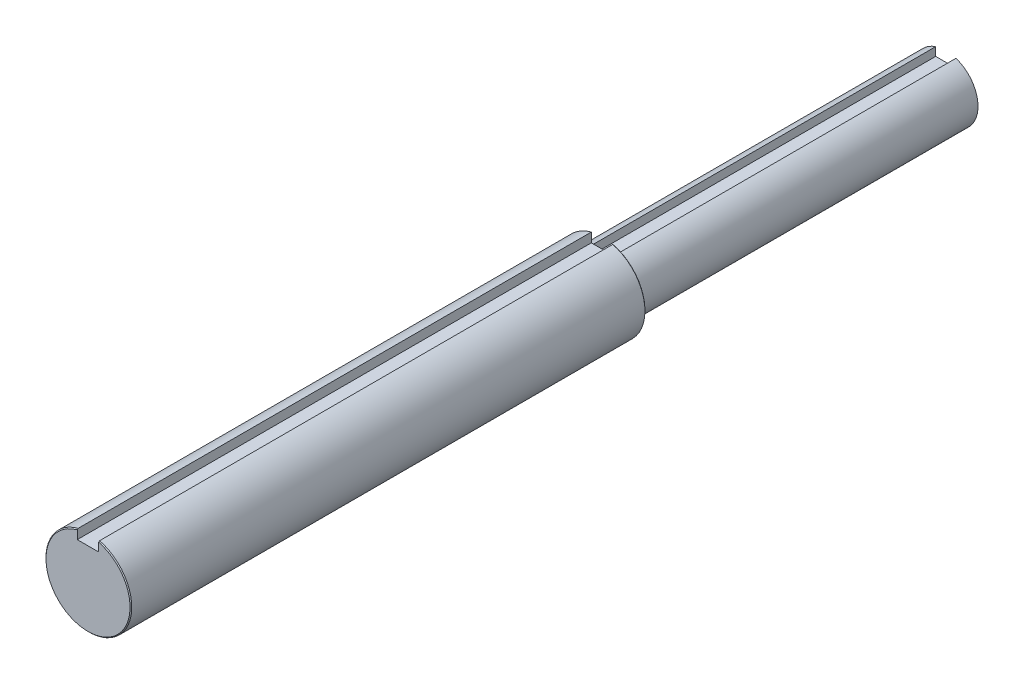
ISO-10303-21;
HEADER;
FILE_DESCRIPTION(('STEP AP214'),'2;1');
FILE_NAME('part.step','',(''),(''),'','','');
FILE_SCHEMA(('AUTOMOTIVE_DESIGN { 1 0 10303 214 1 1 1 1 }'));
ENDSEC;
DATA;
#1=APPLICATION_CONTEXT('core data for automotive mechanical design processes');
#2=APPLICATION_PROTOCOL_DEFINITION('international standard','automotive_design',2000,#1);
#3=PRODUCT_CONTEXT('',#1,'mechanical');
#4=PRODUCT('Part','Part','',(#3));
#5=PRODUCT_RELATED_PRODUCT_CATEGORY('part','',(#4));
#6=PRODUCT_DEFINITION_FORMATION('','',#4);
#7=PRODUCT_DEFINITION_CONTEXT('part definition',#1,'design');
#8=PRODUCT_DEFINITION('design','',#6,#7);
#9=PRODUCT_DEFINITION_SHAPE('','',#8);
#10=(LENGTH_UNIT() NAMED_UNIT(*) SI_UNIT(.MILLI.,.METRE.));
#11=(NAMED_UNIT(*) PLANE_ANGLE_UNIT() SI_UNIT($,.RADIAN.));
#12=(NAMED_UNIT(*) SI_UNIT($,.STERADIAN.) SOLID_ANGLE_UNIT());
#13=UNCERTAINTY_MEASURE_WITH_UNIT(LENGTH_MEASURE(1.E-05),#10,'distance_accuracy_value','');
#14=(GEOMETRIC_REPRESENTATION_CONTEXT(3) GLOBAL_UNCERTAINTY_ASSIGNED_CONTEXT((#13)) GLOBAL_UNIT_ASSIGNED_CONTEXT((#10,
#11,#12)) REPRESENTATION_CONTEXT('',''));
#15=CARTESIAN_POINT('',(0.,0.,0.));
#16=DIRECTION('',(0.,0.,1.));
#17=DIRECTION('',(1.,0.,0.));
#18=AXIS2_PLACEMENT_3D('',#15,#16,#17);
#19=CARTESIAN_POINT('',(0.,0.,304.8));
#20=DIRECTION('',(0.,0.,-1.));
#21=DIRECTION('',(-1.,0.,0.));
#22=AXIS2_PLACEMENT_3D('',#19,#20,#21);
#23=CYLINDRICAL_SURFACE('',#22,12.7);
#24=DIRECTION('',(0.,0.,-1.));
#25=VECTOR('',#24,1.);
#26=CARTESIAN_POINT('',(-3.175,12.2967221242085,304.8));
#27=LINE('',#26,#25);
#28=CARTESIAN_POINT('',(-3.175,12.2967221242085,304.546));
#29=VERTEX_POINT('',#28);
#30=CARTESIAN_POINT('',(-3.175,12.2967221242085,152.6));
#31=VERTEX_POINT('',#30);
#32=EDGE_CURVE('E187',#29,#31,#27,.T.);
#33=ORIENTED_EDGE('',*,*,#32,.T.);
#34=CARTESIAN_POINT('',(0.,0.,152.6));
#35=DIRECTION('',(0.,0.,1.));
#36=DIRECTION('',(1.,0.,0.));
#37=AXIS2_PLACEMENT_3D('',#34,#35,#36);
#38=CIRCLE('',#37,12.7);
#39=CARTESIAN_POINT('',(3.175,12.2967221242085,152.6));
#40=VERTEX_POINT('',#39);
#41=EDGE_CURVE('E59',#31,#40,#38,.T.);
#42=ORIENTED_EDGE('',*,*,#41,.T.);
#43=DIRECTION('',(0.,0.,-1.));
#44=VECTOR('',#43,1.);
#45=CARTESIAN_POINT('',(3.175,12.2967221242085,304.8));
#46=LINE('',#45,#44);
#47=CARTESIAN_POINT('',(3.175,12.2967221242085,304.546));
#48=VERTEX_POINT('',#47);
#49=EDGE_CURVE('E197',#48,#40,#46,.T.);
#50=ORIENTED_EDGE('',*,*,#49,.F.);
#51=CARTESIAN_POINT('',(0.,0.,304.546));
#52=DIRECTION('',(0.,0.,1.));
#53=DIRECTION('',(1.,0.,0.));
#54=AXIS2_PLACEMENT_3D('',#51,#52,#53);
#55=CIRCLE('',#54,12.7);
#56=EDGE_CURVE('E201',#48,#29,#55,.F.);
#57=ORIENTED_EDGE('',*,*,#56,.T.);
#58=EDGE_LOOP('',(#33,#42,#50,#57));
#59=FACE_BOUND('',#58,.T.);
#60=ADVANCED_FACE('F49',(#59),#23,.T.);
#61=CARTESIAN_POINT('',(3.175,9.52499999999995,304.8));
#62=DIRECTION('',(1.,0.,0.));
#63=DIRECTION('',(0.,0.,-1.));
#64=AXIS2_PLACEMENT_3D('',#61,#62,#63);
#65=PLANE('',#64);
#66=ORIENTED_EDGE('',*,*,#49,.T.);
#67=DIRECTION('',(0.,-1.,0.));
#68=VECTOR('',#67,1.);
#69=CARTESIAN_POINT('',(3.175,9.52499999999995,152.6));
#70=LINE('',#69,#68);
#71=CARTESIAN_POINT('',(3.175,9.52499999999995,152.6));
#72=VERTEX_POINT('',#71);
#73=EDGE_CURVE('E294',#40,#72,#70,.T.);
#74=ORIENTED_EDGE('',*,*,#73,.T.);
#75=DIRECTION('',(0.,0.,-1.));
#76=VECTOR('',#75,1.);
#77=CARTESIAN_POINT('',(3.175,9.52499999999995,304.8));
#78=LINE('',#77,#76);
#79=CARTESIAN_POINT('',(3.175,9.52499999999995,304.8));
#80=VERTEX_POINT('',#79);
#81=EDGE_CURVE('E193',#80,#72,#78,.T.);
#82=ORIENTED_EDGE('',*,*,#81,.F.);
#83=DIRECTION('',(0.,-1.,0.));
#84=VECTOR('',#83,1.);
#85=CARTESIAN_POINT('',(3.175,9.52499999999995,304.8));
#86=LINE('',#85,#84);
#87=CARTESIAN_POINT('',(3.175,12.0342133519396,304.8));
#88=VERTEX_POINT('',#87);
#89=EDGE_CURVE('E177',#88,#80,#86,.T.);
#90=ORIENTED_EDGE('',*,*,#89,.F.);
#91=CARTESIAN_POINT('',(3.175,12.0342133519396,304.8));
#92=CARTESIAN_POINT('',(3.175,12.0779793705573,304.757681710846));
#93=CARTESIAN_POINT('',(3.175,12.1217381108952,304.715355899595));
#94=CARTESIAN_POINT('',(3.175,12.2092410349848,304.630689232929));
#95=CARTESIAN_POINT('',(3.175,12.2529852187366,304.588348377512));
#96=CARTESIAN_POINT('',(3.175,12.2967221242085,304.546));
#97=B_SPLINE_CURVE_WITH_KNOTS('',3,(#91,#92,#93,#94,#95,#96),.UNSPECIFIED.,.F.,.F.,(4,2,4),(0.,
0.182638207627681,0.365276415146294),.UNSPECIFIED.);
#98=EDGE_CURVE('E204',#88,#48,#97,.T.);
#99=ORIENTED_EDGE('',*,*,#98,.T.);
#100=EDGE_LOOP('',(#66,#74,#82,#90,#99));
#101=FACE_BOUND('',#100,.T.);
#102=ADVANCED_FACE('F224',(#101),#65,.F.);
#103=CARTESIAN_POINT('',(3.175,9.52499999999995,304.8));
#104=DIRECTION('',(0.,-1.,0.));
#105=DIRECTION('',(0.,0.,-1.));
#106=AXIS2_PLACEMENT_3D('',#103,#104,#105);
#107=PLANE('',#106);
#108=ORIENTED_EDGE('',*,*,#81,.T.);
#109=DIRECTION('',(-1.,0.,0.));
#110=VECTOR('',#109,1.);
#111=CARTESIAN_POINT('',(3.175,9.52499999999995,152.6));
#112=LINE('',#111,#110);
#113=CARTESIAN_POINT('',(-3.175,9.52499999999995,152.6));
#114=VERTEX_POINT('',#113);
#115=EDGE_CURVE('E297',#72,#114,#112,.T.);
#116=ORIENTED_EDGE('',*,*,#115,.T.);
#117=DIRECTION('',(0.,0.,-1.));
#118=VECTOR('',#117,1.);
#119=CARTESIAN_POINT('',(-3.175,9.52499999999995,304.8));
#120=LINE('',#119,#118);
#121=CARTESIAN_POINT('',(-3.175,9.52499999999995,304.8));
#122=VERTEX_POINT('',#121);
#123=EDGE_CURVE('E190',#122,#114,#120,.T.);
#124=ORIENTED_EDGE('',*,*,#123,.F.);
#125=DIRECTION('',(-1.,0.,0.));
#126=VECTOR('',#125,1.);
#127=CARTESIAN_POINT('',(3.175,9.52499999999995,304.8));
#128=LINE('',#127,#126);
#129=EDGE_CURVE('E180',#80,#122,#128,.T.);
#130=ORIENTED_EDGE('',*,*,#129,.F.);
#131=EDGE_LOOP('',(#108,#116,#124,#130));
#132=FACE_BOUND('',#131,.T.);
#133=ADVANCED_FACE('F228',(#132),#107,.F.);
#134=CARTESIAN_POINT('',(-3.175,9.52499999999995,304.8));
#135=DIRECTION('',(-1.,0.,0.));
#136=DIRECTION('',(0.,0.,1.));
#137=AXIS2_PLACEMENT_3D('',#134,#135,#136);
#138=PLANE('',#137);
#139=ORIENTED_EDGE('',*,*,#123,.T.);
#140=DIRECTION('',(0.,1.,0.));
#141=VECTOR('',#140,1.);
#142=CARTESIAN_POINT('',(-3.175,9.52499999999995,152.6));
#143=LINE('',#142,#141);
#144=EDGE_CURVE('E73',#114,#31,#143,.T.);
#145=ORIENTED_EDGE('',*,*,#144,.T.);
#146=ORIENTED_EDGE('',*,*,#32,.F.);
#147=CARTESIAN_POINT('',(-3.175,12.2967221242085,304.546));
#148=CARTESIAN_POINT('',(-3.175,12.2529852187366,304.588348377512));
#149=CARTESIAN_POINT('',(-3.175,12.2092410349848,304.630689232929));
#150=CARTESIAN_POINT('',(-3.175,12.1217381108952,304.715355899595));
#151=CARTESIAN_POINT('',(-3.175,12.0779793705573,304.757681710846));
#152=CARTESIAN_POINT('',(-3.175,12.0342133519395,304.8));
#153=B_SPLINE_CURVE_WITH_KNOTS('',3,(#147,#148,#149,#150,#151,#152),.UNSPECIFIED.,.F.,.F.,(4,2,
4),(0.,0.182638207518613,0.365276415146298),.UNSPECIFIED.);
#154=CARTESIAN_POINT('',(-3.175,12.0342133519396,304.8));
#155=VERTEX_POINT('',#154);
#156=EDGE_CURVE('E213',#29,#155,#153,.T.);
#157=ORIENTED_EDGE('',*,*,#156,.T.);
#158=DIRECTION('',(0.,1.,0.));
#159=VECTOR('',#158,1.);
#160=CARTESIAN_POINT('',(-3.175,9.52499999999995,304.8));
#161=LINE('',#160,#159);
#162=EDGE_CURVE('E183',#122,#155,#161,.T.);
#163=ORIENTED_EDGE('',*,*,#162,.F.);
#164=EDGE_LOOP('',(#139,#145,#146,#157,#163));
#165=FACE_BOUND('',#164,.T.);
#166=ADVANCED_FACE('F394',(#165),#138,.F.);
#167=CARTESIAN_POINT('',(0.,0.,304.8));
#168=DIRECTION('',(0.,0.,1.));
#169=DIRECTION('',(1.,0.,0.));
#170=AXIS2_PLACEMENT_3D('',#167,#168,#169);
#171=PLANE('',#170);
#172=ORIENTED_EDGE('',*,*,#162,.T.);
#173=CARTESIAN_POINT('',(0.,0.,304.8));
#174=DIRECTION('',(0.,0.,1.));
#175=DIRECTION('',(1.,0.,0.));
#176=AXIS2_PLACEMENT_3D('',#173,#174,#175);
#177=CIRCLE('',#176,12.446);
#178=EDGE_CURVE('E361',#155,#88,#177,.T.);
#179=ORIENTED_EDGE('',*,*,#178,.T.);
#180=ORIENTED_EDGE('',*,*,#89,.T.);
#181=ORIENTED_EDGE('',*,*,#129,.T.);
#182=EDGE_LOOP('',(#172,#179,#180,#181));
#183=FACE_BOUND('',#182,.T.);
#184=ADVANCED_FACE('F397',(#183),#171,.T.);
#185=CARTESIAN_POINT('',(0.,0.,304.8));
#186=DIRECTION('',(0.,0.,-1.));
#187=DIRECTION('',(-1.,0.,0.));
#188=AXIS2_PLACEMENT_3D('',#185,#186,#187);
#189=CONICAL_SURFACE('',#188,12.446,0.785398163397377);
#190=ORIENTED_EDGE('',*,*,#156,.F.);
#191=ORIENTED_EDGE('',*,*,#56,.F.);
#192=ORIENTED_EDGE('',*,*,#98,.F.);
#193=ORIENTED_EDGE('',*,*,#178,.F.);
#194=EDGE_LOOP('',(#190,#191,#192,#193));
#195=FACE_BOUND('',#194,.T.);
#196=ADVANCED_FACE('F220',(#195),#189,.T.);
#197=CARTESIAN_POINT('',(0.,0.,152.4));
#198=DIRECTION('',(0.,0.,1.));
#199=DIRECTION('',(1.,0.,0.));
#200=AXIS2_PLACEMENT_3D('',#197,#198,#199);
#201=PLANE('',#200);
#202=DIRECTION('',(-1.,0.,0.));
#203=VECTOR('',#202,1.);
#204=CARTESIAN_POINT('',(-3.,6.72499999999999,152.4));
#205=LINE('',#204,#203);
#206=CARTESIAN_POINT('',(2.79999999999996,6.72499999999999,152.4));
#207=VERTEX_POINT('',#206);
#208=CARTESIAN_POINT('',(-2.79999999999996,6.72499999999999,152.4));
#209=VERTEX_POINT('',#208);
#210=EDGE_CURVE('E374',#207,#209,#205,.T.);
#211=ORIENTED_EDGE('',*,*,#210,.T.);
#212=DIRECTION('',(0.,1.,0.));
#213=VECTOR('',#212,1.);
#214=CARTESIAN_POINT('',(-2.79999999999996,9.04022261894031,152.4));
#215=LINE('',#214,#213);
#216=CARTESIAN_POINT('',(-2.79999999999996,9.31319628269481,152.4));
#217=VERTEX_POINT('',#216);
#218=EDGE_CURVE('E376',#209,#217,#215,.T.);
#219=ORIENTED_EDGE('',*,*,#218,.T.);
#220=CARTESIAN_POINT('',(0.,0.,152.4));
#221=DIRECTION('',(0.,0.,1.));
#222=DIRECTION('',(1.,0.,0.));
#223=AXIS2_PLACEMENT_3D('',#220,#221,#222);
#224=CIRCLE('',#223,9.72500000000001);
#225=CARTESIAN_POINT('',(2.79999999999996,9.31319628269481,152.4));
#226=VERTEX_POINT('',#225);
#227=EDGE_CURVE('E355',#217,#226,#224,.T.);
#228=ORIENTED_EDGE('',*,*,#227,.T.);
#229=DIRECTION('',(0.,-1.,0.));
#230=VECTOR('',#229,1.);
#231=CARTESIAN_POINT('',(2.79999999999996,6.52499999999995,152.4));
#232=LINE('',#231,#230);
#233=EDGE_CURVE('E372',#226,#207,#232,.T.);
#234=ORIENTED_EDGE('',*,*,#233,.T.);
#235=EDGE_LOOP('',(#211,#219,#228,#234));
#236=FACE_BOUND('',#235,.T.);
#237=DIRECTION('',(0.,-1.,0.));
#238=VECTOR('',#237,1.);
#239=CARTESIAN_POINT('',(-3.375,0.,152.4));
#240=LINE('',#239,#238);
#241=CARTESIAN_POINT('',(-3.375,12.0357540270645,152.4));
#242=VERTEX_POINT('',#241);
#243=CARTESIAN_POINT('',(-3.375,9.32499999999996,152.4));
#244=VERTEX_POINT('',#243);
#245=EDGE_CURVE('E255',#242,#244,#240,.T.);
#246=ORIENTED_EDGE('',*,*,#245,.T.);
#247=DIRECTION('',(1.,0.,0.));
#248=VECTOR('',#247,1.);
#249=CARTESIAN_POINT('',(0.,9.32499999999996,152.4));
#250=LINE('',#249,#248);
#251=CARTESIAN_POINT('',(3.375,9.32499999999996,152.4));
#252=VERTEX_POINT('',#251);
#253=EDGE_CURVE('E369',#244,#252,#250,.T.);
#254=ORIENTED_EDGE('',*,*,#253,.T.);
#255=DIRECTION('',(0.,1.,0.));
#256=VECTOR('',#255,1.);
#257=CARTESIAN_POINT('',(3.375,0.,152.4));
#258=LINE('',#257,#256);
#259=CARTESIAN_POINT('',(3.375,12.0357540270645,152.4));
#260=VERTEX_POINT('',#259);
#261=EDGE_CURVE('E292',#252,#260,#258,.T.);
#262=ORIENTED_EDGE('',*,*,#261,.T.);
#263=CARTESIAN_POINT('',(0.,0.,152.4));
#264=DIRECTION('',(0.,0.,1.));
#265=DIRECTION('',(1.,0.,0.));
#266=AXIS2_PLACEMENT_3D('',#263,#264,#265);
#267=CIRCLE('',#266,12.5);
#268=EDGE_CURVE('E360',#260,#242,#267,.F.);
#269=ORIENTED_EDGE('',*,*,#268,.T.);
#270=EDGE_LOOP('',(#246,#254,#262,#269));
#271=FACE_BOUND('',#270,.T.);
#272=ADVANCED_FACE('F386',(#236,#271),#201,.F.);
#273=CARTESIAN_POINT('',(0.,0.,-304.8));
#274=DIRECTION('',(0.,0.,1.));
#275=DIRECTION('',(1.,0.,0.));
#276=AXIS2_PLACEMENT_3D('',#273,#274,#275);
#277=CYLINDRICAL_SURFACE('',#276,9.525);
#278=CARTESIAN_POINT('',(0.,0.,50.8));
#279=DIRECTION('',(0.,0.,1.));
#280=DIRECTION('',(1.,0.,0.));
#281=AXIS2_PLACEMENT_3D('',#278,#279,#280);
#282=CIRCLE('',#281,9.525);
#283=CARTESIAN_POINT('',(3.,9.04022261894031,50.8));
#284=VERTEX_POINT('',#283);
#285=CARTESIAN_POINT('',(-3.,9.04022261894031,50.7999999999998));
#286=VERTEX_POINT('',#285);
#287=EDGE_CURVE('E66',#284,#286,#282,.F.);
#288=ORIENTED_EDGE('',*,*,#287,.F.);
#289=DIRECTION('',(0.,0.,1.));
#290=VECTOR('',#289,1.);
#291=CARTESIAN_POINT('',(3.,9.04022261894031,-304.8));
#292=LINE('',#291,#290);
#293=CARTESIAN_POINT('',(3.,9.04022261894031,152.2));
#294=VERTEX_POINT('',#293);
#295=EDGE_CURVE('E174',#294,#284,#292,.F.);
#296=ORIENTED_EDGE('',*,*,#295,.F.);
#297=CARTESIAN_POINT('',(0.,0.,152.2));
#298=DIRECTION('',(0.,0.,1.));
#299=DIRECTION('',(1.,0.,0.));
#300=AXIS2_PLACEMENT_3D('',#297,#298,#299);
#301=CIRCLE('',#300,9.525);
#302=CARTESIAN_POINT('',(-3.,9.04022261894031,152.2));
#303=VERTEX_POINT('',#302);
#304=EDGE_CURVE('E300',#294,#303,#301,.F.);
#305=ORIENTED_EDGE('',*,*,#304,.T.);
#306=DIRECTION('',(0.,0.,1.));
#307=VECTOR('',#306,1.);
#308=CARTESIAN_POINT('',(-3.,9.04022261894031,-304.8));
#309=LINE('',#308,#307);
#310=EDGE_CURVE('E166',#286,#303,#309,.T.);
#311=ORIENTED_EDGE('',*,*,#310,.F.);
#312=EDGE_LOOP('',(#288,#296,#305,#311));
#313=FACE_BOUND('',#312,.T.);
#314=ADVANCED_FACE('F347',(#313),#277,.T.);
#315=CARTESIAN_POINT('',(3.,12.525,-304.8));
#316=DIRECTION('',(1.,0.,0.));
#317=DIRECTION('',(0.,1.,0.));
#318=AXIS2_PLACEMENT_3D('',#315,#316,#317);
#319=PLANE('',#318);
#320=ORIENTED_EDGE('',*,*,#295,.T.);
#321=DIRECTION('',(0.,-1.,0.));
#322=VECTOR('',#321,1.);
#323=CARTESIAN_POINT('',(3.,12.525,50.8));
#324=LINE('',#323,#322);
#325=CARTESIAN_POINT('',(3.,6.52499999999995,50.8));
#326=VERTEX_POINT('',#325);
#327=EDGE_CURVE('E158',#284,#326,#324,.T.);
#328=ORIENTED_EDGE('',*,*,#327,.T.);
#329=DIRECTION('',(0.,0.,1.));
#330=VECTOR('',#329,1.);
#331=CARTESIAN_POINT('',(3.,6.52499999999995,-304.8));
#332=LINE('',#331,#330);
#333=CARTESIAN_POINT('',(3.,6.52499999999995,152.2));
#334=VERTEX_POINT('',#333);
#335=EDGE_CURVE('E157',#326,#334,#332,.T.);
#336=ORIENTED_EDGE('',*,*,#335,.T.);
#337=DIRECTION('',(0.,1.,0.));
#338=VECTOR('',#337,1.);
#339=CARTESIAN_POINT('',(3.,9.04022261894031,152.2));
#340=LINE('',#339,#338);
#341=EDGE_CURVE('E353',#334,#294,#340,.T.);
#342=ORIENTED_EDGE('',*,*,#341,.T.);
#343=EDGE_LOOP('',(#320,#328,#336,#342));
#344=FACE_BOUND('',#343,.T.);
#345=ADVANCED_FACE('F344',(#344),#319,.F.);
#346=CARTESIAN_POINT('',(-3.,6.52499999999995,-304.8));
#347=DIRECTION('',(0.,-1.,0.));
#348=DIRECTION('',(0.,0.,-1.));
#349=AXIS2_PLACEMENT_3D('',#346,#347,#348);
#350=PLANE('',#349);
#351=ORIENTED_EDGE('',*,*,#335,.F.);
#352=DIRECTION('',(-1.,0.,0.));
#353=VECTOR('',#352,1.);
#354=CARTESIAN_POINT('',(-3.,6.52499999999995,50.8));
#355=LINE('',#354,#353);
#356=CARTESIAN_POINT('',(-3.,6.52499999999995,50.8));
#357=VERTEX_POINT('',#356);
#358=EDGE_CURVE('E146',#326,#357,#355,.T.);
#359=ORIENTED_EDGE('',*,*,#358,.T.);
#360=DIRECTION('',(0.,0.,1.));
#361=VECTOR('',#360,1.);
#362=CARTESIAN_POINT('',(-3.,6.52499999999995,-304.8));
#363=LINE('',#362,#361);
#364=CARTESIAN_POINT('',(-3.,6.52499999999995,152.2));
#365=VERTEX_POINT('',#364);
#366=EDGE_CURVE('E155',#357,#365,#363,.T.);
#367=ORIENTED_EDGE('',*,*,#366,.T.);
#368=DIRECTION('',(1.,0.,0.));
#369=VECTOR('',#368,1.);
#370=CARTESIAN_POINT('',(3.,6.52499999999995,152.2));
#371=LINE('',#370,#369);
#372=EDGE_CURVE('E378',#365,#334,#371,.T.);
#373=ORIENTED_EDGE('',*,*,#372,.T.);
#374=EDGE_LOOP('',(#351,#359,#367,#373));
#375=FACE_BOUND('',#374,.T.);
#376=ADVANCED_FACE('F153',(#375),#350,.F.);
#377=CARTESIAN_POINT('',(-3.,12.525,-304.8));
#378=DIRECTION('',(-1.,0.,0.));
#379=DIRECTION('',(0.,-1.,0.));
#380=AXIS2_PLACEMENT_3D('',#377,#378,#379);
#381=PLANE('',#380);
#382=ORIENTED_EDGE('',*,*,#366,.F.);
#383=DIRECTION('',(0.,1.,0.));
#384=VECTOR('',#383,1.);
#385=CARTESIAN_POINT('',(-3.,12.525,50.8));
#386=LINE('',#385,#384);
#387=EDGE_CURVE('E11',#357,#286,#386,.T.);
#388=ORIENTED_EDGE('',*,*,#387,.T.);
#389=ORIENTED_EDGE('',*,*,#310,.T.);
#390=DIRECTION('',(0.,-1.,0.));
#391=VECTOR('',#390,1.);
#392=CARTESIAN_POINT('',(-3.,6.52499999999995,152.2));
#393=LINE('',#392,#391);
#394=EDGE_CURVE('E163',#303,#365,#393,.T.);
#395=ORIENTED_EDGE('',*,*,#394,.T.);
#396=EDGE_LOOP('',(#382,#388,#389,#395));
#397=FACE_BOUND('',#396,.T.);
#398=ADVANCED_FACE('F161',(#397),#381,.F.);
#399=CARTESIAN_POINT('',(3.,12.525,152.2));
#400=DIRECTION('',(-0.707106781186394,0.,-0.707106781186701));
#401=DIRECTION('',(0.,-1.,0.));
#402=AXIS2_PLACEMENT_3D('',#399,#400,#401);
#403=PLANE('',#402);
#404=DIRECTION('',(-0.57735026918971,0.577350269189709,0.577350269189459));
#405=VECTOR('',#404,1.);
#406=CARTESIAN_POINT('',(0.999999999999419,8.52500000000053,154.2));
#407=LINE('',#406,#405);
#408=EDGE_CURVE('E169',#207,#334,#407,.F.);
#409=ORIENTED_EDGE('',*,*,#408,.F.);
#410=ORIENTED_EDGE('',*,*,#233,.F.);
#411=CARTESIAN_POINT('',(3.,9.04022261894031,152.2));
#412=CARTESIAN_POINT('',(2.96690574453186,9.08606857413627,152.233094255468));
#413=CARTESIAN_POINT('',(2.93369194772278,9.13173936028566,152.266308052277));
#414=CARTESIAN_POINT('',(2.8670252809875,9.22273058143663,152.332974719012));
#415=CARTESIAN_POINT('',(2.8335724111299,9.26805101653874,152.36642758887));
#416=CARTESIAN_POINT('',(2.79999999999997,9.3131962826948,152.4));
#417=B_SPLINE_CURVE_WITH_KNOTS('',3,(#411,#412,#413,#414,#415,#416),.UNSPECIFIED.,.F.,.F.,(4,2,
4),(0.,0.196543124377538,0.39308619235849),.UNSPECIFIED.);
#418=EDGE_CURVE('E164',#294,#226,#417,.T.);
#419=ORIENTED_EDGE('',*,*,#418,.F.);
#420=ORIENTED_EDGE('',*,*,#341,.F.);
#421=EDGE_LOOP('',(#409,#410,#419,#420));
#422=FACE_BOUND('',#421,.T.);
#423=ADVANCED_FACE('F330',(#422),#403,.T.);
#424=CARTESIAN_POINT('',(0.,0.,152.4));
#425=DIRECTION('',(0.,0.,1.));
#426=DIRECTION('',(1.,0.,0.));
#427=AXIS2_PLACEMENT_3D('',#424,#425,#426);
#428=CONICAL_SURFACE('',#427,9.72500000000004,0.785398163397596);
#429=ORIENTED_EDGE('',*,*,#418,.T.);
#430=ORIENTED_EDGE('',*,*,#227,.F.);
#431=CARTESIAN_POINT('',(-2.79999999999996,9.31319628269481,152.4));
#432=CARTESIAN_POINT('',(-2.83357241112989,9.26805101653875,152.36642758887));
#433=CARTESIAN_POINT('',(-2.86702528098749,9.22273058143663,152.332974719012));
#434=CARTESIAN_POINT('',(-2.93369194772278,9.13173936028565,152.266308052277));
#435=CARTESIAN_POINT('',(-2.96690574453187,9.08606857413626,152.233094255468));
#436=CARTESIAN_POINT('',(-3.00000000000003,9.04022261894028,152.2));
#437=B_SPLINE_CURVE_WITH_KNOTS('',3,(#431,#432,#433,#434,#435,#436),.UNSPECIFIED.,.F.,.F.,(4,2,
4),(0.,0.19654306798096,0.393086192358494),.UNSPECIFIED.);
#438=EDGE_CURVE('E305',#303,#217,#437,.F.);
#439=ORIENTED_EDGE('',*,*,#438,.F.);
#440=ORIENTED_EDGE('',*,*,#304,.F.);
#441=EDGE_LOOP('',(#429,#430,#439,#440));
#442=FACE_BOUND('',#441,.T.);
#443=ADVANCED_FACE('F313',(#442),#428,.T.);
#444=CARTESIAN_POINT('',(-3.,6.52499999999995,152.2));
#445=DIRECTION('',(0.,0.707106781186394,-0.707106781186701));
#446=DIRECTION('',(-1.,0.,0.));
#447=AXIS2_PLACEMENT_3D('',#444,#445,#446);
#448=PLANE('',#447);
#449=ORIENTED_EDGE('',*,*,#408,.T.);
#450=ORIENTED_EDGE('',*,*,#372,.F.);
#451=DIRECTION('',(0.577350269189709,0.577350269189709,0.577350269189459));
#452=VECTOR('',#451,1.);
#453=CARTESIAN_POINT('',(-0.999999999999422,8.52500000000053,154.2));
#454=LINE('',#453,#452);
#455=EDGE_CURVE('E258',#209,#365,#454,.F.);
#456=ORIENTED_EDGE('',*,*,#455,.F.);
#457=ORIENTED_EDGE('',*,*,#210,.F.);
#458=EDGE_LOOP('',(#449,#450,#456,#457));
#459=FACE_BOUND('',#458,.T.);
#460=ADVANCED_FACE('F322',(#459),#448,.T.);
#461=CARTESIAN_POINT('',(-3.,12.525,152.2));
#462=DIRECTION('',(0.707106781186394,0.,-0.707106781186701));
#463=DIRECTION('',(0.,1.,0.));
#464=AXIS2_PLACEMENT_3D('',#461,#462,#463);
#465=PLANE('',#464);
#466=ORIENTED_EDGE('',*,*,#438,.T.);
#467=ORIENTED_EDGE('',*,*,#218,.F.);
#468=ORIENTED_EDGE('',*,*,#455,.T.);
#469=ORIENTED_EDGE('',*,*,#394,.F.);
#470=EDGE_LOOP('',(#466,#467,#468,#469));
#471=FACE_BOUND('',#470,.T.);
#472=ADVANCED_FACE('F289',(#471),#465,.T.);
#473=CARTESIAN_POINT('',(0.,0.,152.6));
#474=DIRECTION('',(0.,0.,1.));
#475=DIRECTION('',(1.,0.,0.));
#476=AXIS2_PLACEMENT_3D('',#473,#474,#475);
#477=CONICAL_SURFACE('',#476,12.7,0.785398163397357);
#478=CARTESIAN_POINT('',(-3.175,12.2967221242085,152.6));
#479=CARTESIAN_POINT('',(-3.20849772459394,12.253479418142,152.566502275406));
#480=CARTESIAN_POINT('',(-3.24191325261739,12.2101107249201,152.533086747383));
#481=CARTESIAN_POINT('',(-3.30857991930269,12.123121359234,152.466420080697));
#482=CARTESIAN_POINT('',(-3.34183105794591,12.0795006867412,152.433168942054));
#483=CARTESIAN_POINT('',(-3.37499999999999,12.0357540270645,152.4));
#484=B_SPLINE_CURVE_WITH_KNOTS('',3,(#478,#479,#480,#481,#482,#483),.UNSPECIFIED.,.F.,.F.,(4,2,
4),(0.,0.192422314718215,0.3848446512537),.UNSPECIFIED.);
#485=EDGE_CURVE('E245',#242,#31,#484,.F.);
#486=ORIENTED_EDGE('',*,*,#485,.F.);
#487=ORIENTED_EDGE('',*,*,#268,.F.);
#488=CARTESIAN_POINT('',(3.375,12.0357540270645,152.4));
#489=CARTESIAN_POINT('',(3.34183105794591,12.0795006867412,152.433168942054));
#490=CARTESIAN_POINT('',(3.30857991930269,12.123121359234,152.466420080697));
#491=CARTESIAN_POINT('',(3.24191325261739,12.2101107249201,152.533086747383));
#492=CARTESIAN_POINT('',(3.20849772459394,12.253479418142,152.566502275406));
#493=CARTESIAN_POINT('',(3.175,12.2967221242085,152.6));
#494=B_SPLINE_CURVE_WITH_KNOTS('',3,(#488,#489,#490,#491,#492,#493),.UNSPECIFIED.,.F.,.F.,(4,2,
4),(0.,0.192422336535488,0.384844651253706),.UNSPECIFIED.);
#495=EDGE_CURVE('E248',#40,#260,#494,.F.);
#496=ORIENTED_EDGE('',*,*,#495,.F.);
#497=ORIENTED_EDGE('',*,*,#41,.F.);
#498=EDGE_LOOP('',(#486,#487,#496,#497));
#499=FACE_BOUND('',#498,.T.);
#500=ADVANCED_FACE('F243',(#499),#477,.T.);
#501=CARTESIAN_POINT('',(3.175,9.52499999999995,152.6));
#502=DIRECTION('',(0.707106781186612,0.,0.707106781186483));
#503=DIRECTION('',(0.,-1.,0.));
#504=AXIS2_PLACEMENT_3D('',#501,#502,#503);
#505=PLANE('',#504);
#506=ORIENTED_EDGE('',*,*,#495,.T.);
#507=ORIENTED_EDGE('',*,*,#261,.F.);
#508=DIRECTION('',(-0.577350269189591,0.577350269189591,0.577350269189696));
#509=VECTOR('',#508,1.);
#510=CARTESIAN_POINT('',(3.175,9.52499999999995,152.6));
#511=LINE('',#510,#509);
#512=EDGE_CURVE('E256',#72,#252,#511,.F.);
#513=ORIENTED_EDGE('',*,*,#512,.F.);
#514=ORIENTED_EDGE('',*,*,#73,.F.);
#515=EDGE_LOOP('',(#506,#507,#513,#514));
#516=FACE_BOUND('',#515,.T.);
#517=ADVANCED_FACE('F52',(#516),#505,.F.);
#518=CARTESIAN_POINT('',(-3.175,9.52499999999995,152.6));
#519=DIRECTION('',(-0.707106781186612,0.,0.707106781186483));
#520=DIRECTION('',(0.,1.,0.));
#521=AXIS2_PLACEMENT_3D('',#518,#519,#520);
#522=PLANE('',#521);
#523=ORIENTED_EDGE('',*,*,#485,.T.);
#524=ORIENTED_EDGE('',*,*,#144,.F.);
#525=DIRECTION('',(-0.577350269189591,-0.577350269189591,-0.577350269189696));
#526=VECTOR('',#525,1.);
#527=CARTESIAN_POINT('',(-1.05833333333359,11.6416666666664,154.716666666667));
#528=LINE('',#527,#526);
#529=EDGE_CURVE('E259',#244,#114,#528,.F.);
#530=ORIENTED_EDGE('',*,*,#529,.F.);
#531=ORIENTED_EDGE('',*,*,#245,.F.);
#532=EDGE_LOOP('',(#523,#524,#530,#531));
#533=FACE_BOUND('',#532,.T.);
#534=ADVANCED_FACE('F252',(#533),#522,.F.);
#535=CARTESIAN_POINT('',(3.175,9.52499999999995,152.6));
#536=DIRECTION('',(0.,-0.707106781186612,0.707106781186483));
#537=DIRECTION('',(-1.,0.,0.));
#538=AXIS2_PLACEMENT_3D('',#535,#536,#537);
#539=PLANE('',#538);
#540=ORIENTED_EDGE('',*,*,#512,.T.);
#541=ORIENTED_EDGE('',*,*,#253,.F.);
#542=ORIENTED_EDGE('',*,*,#529,.T.);
#543=ORIENTED_EDGE('',*,*,#115,.F.);
#544=EDGE_LOOP('',(#540,#541,#542,#543));
#545=FACE_BOUND('',#544,.T.);
#546=ADVANCED_FACE('F279',(#545),#539,.F.);
#547=CARTESIAN_POINT('',(0.,0.,50.8));
#548=DIRECTION('',(0.,0.,1.));
#549=DIRECTION('',(1.,0.,0.));
#550=AXIS2_PLACEMENT_3D('',#547,#548,#549);
#551=PLANE('',#550);
#552=ORIENTED_EDGE('',*,*,#287,.T.);
#553=ORIENTED_EDGE('',*,*,#387,.F.);
#554=ORIENTED_EDGE('',*,*,#358,.F.);
#555=ORIENTED_EDGE('',*,*,#327,.F.);
#556=EDGE_LOOP('',(#552,#553,#554,#555));
#557=FACE_BOUND('',#556,.T.);
#558=ADVANCED_FACE('F145',(#557),#551,.F.);
#559=CLOSED_SHELL('',(#60,#102,#133,#166,#184,#196,#272,#314,#345,#376,#398,#423,#443,#460,#472,
#500,#517,#534,#546,#558));
#560=MANIFOLD_SOLID_BREP('B2',#559);
#561=ADVANCED_BREP_SHAPE_REPRESENTATION('',(#18,#560),#14);
#562=SHAPE_DEFINITION_REPRESENTATION(#9,#561);
ENDSEC;
END-ISO-10303-21;
